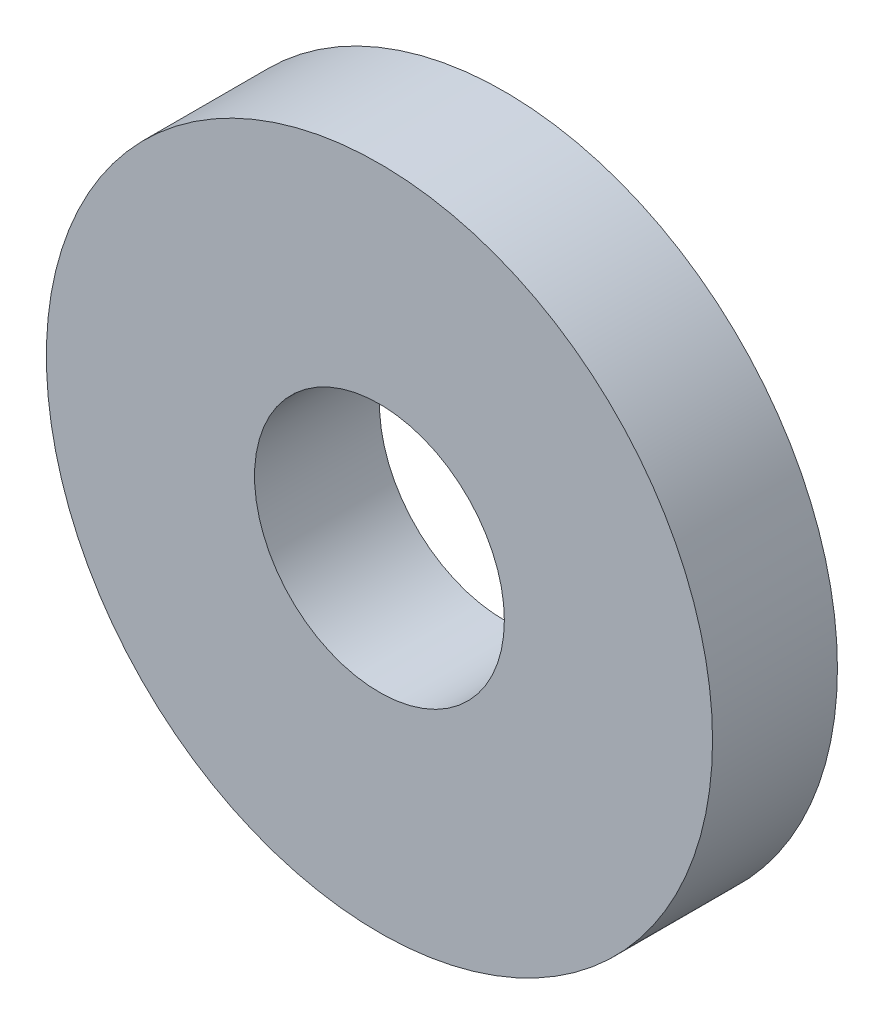
ISO-10303-21;
HEADER;
FILE_DESCRIPTION(('STEP AP214'),'2;1');
FILE_NAME('part.step','',(''),(''),'','','');
FILE_SCHEMA(('AUTOMOTIVE_DESIGN { 1 0 10303 214 1 1 1 1 }'));
ENDSEC;
DATA;
#1=APPLICATION_CONTEXT('core data for automotive mechanical design processes');
#2=APPLICATION_PROTOCOL_DEFINITION('international standard','automotive_design',2000,#1);
#3=PRODUCT_CONTEXT('',#1,'mechanical');
#4=PRODUCT('Part','Part','',(#3));
#5=PRODUCT_RELATED_PRODUCT_CATEGORY('part','',(#4));
#6=PRODUCT_DEFINITION_FORMATION('','',#4);
#7=PRODUCT_DEFINITION_CONTEXT('part definition',#1,'design');
#8=PRODUCT_DEFINITION('design','',#6,#7);
#9=PRODUCT_DEFINITION_SHAPE('','',#8);
#10=(LENGTH_UNIT() NAMED_UNIT(*) SI_UNIT(.MILLI.,.METRE.));
#11=(NAMED_UNIT(*) PLANE_ANGLE_UNIT() SI_UNIT($,.RADIAN.));
#12=(NAMED_UNIT(*) SI_UNIT($,.STERADIAN.) SOLID_ANGLE_UNIT());
#13=UNCERTAINTY_MEASURE_WITH_UNIT(LENGTH_MEASURE(1.E-05),#10,'distance_accuracy_value','');
#14=(GEOMETRIC_REPRESENTATION_CONTEXT(3) GLOBAL_UNCERTAINTY_ASSIGNED_CONTEXT((#13)) GLOBAL_UNIT_ASSIGNED_CONTEXT((#10,
#11,#12)) REPRESENTATION_CONTEXT('',''));
#15=CARTESIAN_POINT('',(0.,0.,0.));
#16=DIRECTION('',(0.,0.,1.));
#17=DIRECTION('',(1.,0.,0.));
#18=AXIS2_PLACEMENT_3D('',#15,#16,#17);
#19=CARTESIAN_POINT('',(0.,0.,12.));
#20=DIRECTION('',(0.,0.,1.));
#21=DIRECTION('',(1.,0.,0.));
#22=AXIS2_PLACEMENT_3D('',#19,#20,#21);
#23=PLANE('',#22);
#24=CARTESIAN_POINT('',(0.,0.,12.));
#25=DIRECTION('',(0.,0.,1.));
#26=DIRECTION('',(1.,0.,0.));
#27=AXIS2_PLACEMENT_3D('',#24,#25,#26);
#28=CIRCLE('',#27,32.);
#29=CARTESIAN_POINT('',(32.,0.,12.));
#30=VERTEX_POINT('',#29);
#31=EDGE_CURVE('E10',#30,#30,#28,.T.);
#32=ORIENTED_EDGE('',*,*,#31,.T.);
#33=EDGE_LOOP('',(#32));
#34=FACE_BOUND('',#33,.T.);
#35=CARTESIAN_POINT('',(0.,0.,12.));
#36=DIRECTION('',(0.,0.,1.));
#37=DIRECTION('',(1.,0.,0.));
#38=AXIS2_PLACEMENT_3D('',#35,#36,#37);
#39=CIRCLE('',#38,12.);
#40=CARTESIAN_POINT('',(12.,0.,12.));
#41=VERTEX_POINT('',#40);
#42=EDGE_CURVE('E44',#41,#41,#39,.T.);
#43=ORIENTED_EDGE('',*,*,#42,.F.);
#44=EDGE_LOOP('',(#43));
#45=FACE_BOUND('',#44,.T.);
#46=ADVANCED_FACE('F33',(#34,#45),#23,.T.);
#47=CARTESIAN_POINT('',(0.,0.,0.));
#48=DIRECTION('',(0.,0.,1.));
#49=DIRECTION('',(1.,0.,0.));
#50=AXIS2_PLACEMENT_3D('',#47,#48,#49);
#51=PLANE('',#50);
#52=CARTESIAN_POINT('',(0.,0.,0.));
#53=DIRECTION('',(0.,0.,1.));
#54=DIRECTION('',(1.,0.,0.));
#55=AXIS2_PLACEMENT_3D('',#52,#53,#54);
#56=CIRCLE('',#55,32.);
#57=CARTESIAN_POINT('',(32.,0.,0.));
#58=VERTEX_POINT('',#57);
#59=EDGE_CURVE('E37',#58,#58,#56,.T.);
#60=ORIENTED_EDGE('',*,*,#59,.F.);
#61=EDGE_LOOP('',(#60));
#62=FACE_BOUND('',#61,.T.);
#63=CARTESIAN_POINT('',(0.,0.,0.));
#64=DIRECTION('',(0.,0.,1.));
#65=DIRECTION('',(1.,0.,0.));
#66=AXIS2_PLACEMENT_3D('',#63,#64,#65);
#67=CIRCLE('',#66,12.);
#68=CARTESIAN_POINT('',(12.,0.,0.));
#69=VERTEX_POINT('',#68);
#70=EDGE_CURVE('E46',#69,#69,#67,.T.);
#71=ORIENTED_EDGE('',*,*,#70,.T.);
#72=EDGE_LOOP('',(#71));
#73=FACE_BOUND('',#72,.T.);
#74=ADVANCED_FACE('F56',(#62,#73),#51,.F.);
#75=CARTESIAN_POINT('',(0.,0.,12.));
#76=DIRECTION('',(0.,0.,-1.));
#77=DIRECTION('',(-1.,0.,0.));
#78=AXIS2_PLACEMENT_3D('',#75,#76,#77);
#79=CYLINDRICAL_SURFACE('',#78,32.);
#80=ORIENTED_EDGE('',*,*,#31,.F.);
#81=EDGE_LOOP('',(#80));
#82=FACE_BOUND('',#81,.T.);
#83=ORIENTED_EDGE('',*,*,#59,.T.);
#84=EDGE_LOOP('',(#83));
#85=FACE_BOUND('',#84,.T.);
#86=ADVANCED_FACE('F35',(#82,#85),#79,.T.);
#87=CARTESIAN_POINT('',(0.,0.,12.));
#88=DIRECTION('',(0.,0.,-1.));
#89=DIRECTION('',(-1.,0.,0.));
#90=AXIS2_PLACEMENT_3D('',#87,#88,#89);
#91=CYLINDRICAL_SURFACE('',#90,12.);
#92=ORIENTED_EDGE('',*,*,#42,.T.);
#93=EDGE_LOOP('',(#92));
#94=FACE_BOUND('',#93,.T.);
#95=ORIENTED_EDGE('',*,*,#70,.F.);
#96=EDGE_LOOP('',(#95));
#97=FACE_BOUND('',#96,.T.);
#98=ADVANCED_FACE('F52',(#94,#97),#91,.F.);
#99=CLOSED_SHELL('',(#46,#74,#86,#98));
#100=MANIFOLD_SOLID_BREP('B2',#99);
#101=ADVANCED_BREP_SHAPE_REPRESENTATION('',(#18,#100),#14);
#102=SHAPE_DEFINITION_REPRESENTATION(#9,#101);
ENDSEC;
END-ISO-10303-21;
